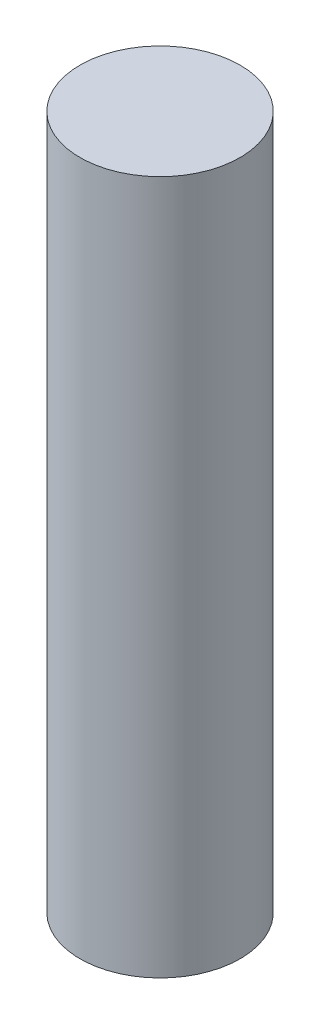
ISO-10303-21;
HEADER;
FILE_DESCRIPTION(('STEP AP214'),'2;1');
FILE_NAME('part.step','',(''),(''),'','','');
FILE_SCHEMA(('AUTOMOTIVE_DESIGN { 1 0 10303 214 1 1 1 1 }'));
ENDSEC;
DATA;
#1=APPLICATION_CONTEXT('core data for automotive mechanical design processes');
#2=APPLICATION_PROTOCOL_DEFINITION('international standard','automotive_design',2000,#1);
#3=PRODUCT_CONTEXT('',#1,'mechanical');
#4=PRODUCT('Part','Part','',(#3));
#5=PRODUCT_RELATED_PRODUCT_CATEGORY('part','',(#4));
#6=PRODUCT_DEFINITION_FORMATION('','',#4);
#7=PRODUCT_DEFINITION_CONTEXT('part definition',#1,'design');
#8=PRODUCT_DEFINITION('design','',#6,#7);
#9=PRODUCT_DEFINITION_SHAPE('','',#8);
#10=(LENGTH_UNIT() NAMED_UNIT(*) SI_UNIT(.MILLI.,.METRE.));
#11=(NAMED_UNIT(*) PLANE_ANGLE_UNIT() SI_UNIT($,.RADIAN.));
#12=(NAMED_UNIT(*) SI_UNIT($,.STERADIAN.) SOLID_ANGLE_UNIT());
#13=UNCERTAINTY_MEASURE_WITH_UNIT(LENGTH_MEASURE(1.E-05),#10,'distance_accuracy_value','');
#14=(GEOMETRIC_REPRESENTATION_CONTEXT(3) GLOBAL_UNCERTAINTY_ASSIGNED_CONTEXT((#13)) GLOBAL_UNIT_ASSIGNED_CONTEXT((#10,
#11,#12)) REPRESENTATION_CONTEXT('',''));
#15=CARTESIAN_POINT('',(0.,0.,0.));
#16=DIRECTION('',(0.,0.,1.));
#17=DIRECTION('',(1.,0.,0.));
#18=AXIS2_PLACEMENT_3D('',#15,#16,#17);
#19=CARTESIAN_POINT('',(0.,0.,0.));
#20=DIRECTION('',(0.,-1.,0.));
#21=DIRECTION('',(0.,0.,-1.));
#22=AXIS2_PLACEMENT_3D('',#19,#20,#21);
#23=PLANE('',#22);
#24=CARTESIAN_POINT('',(0.,0.,0.));
#25=DIRECTION('',(0.,-1.,0.));
#26=DIRECTION('',(0.,0.,-1.));
#27=AXIS2_PLACEMENT_3D('',#24,#25,#26);
#28=CIRCLE('',#27,1.5);
#29=CARTESIAN_POINT('',(0.,0.,-1.5));
#30=VERTEX_POINT('',#29);
#31=EDGE_CURVE('E10',#30,#30,#28,.T.);
#32=ORIENTED_EDGE('',*,*,#31,.T.);
#33=EDGE_LOOP('',(#32));
#34=FACE_BOUND('',#33,.T.);
#35=ADVANCED_FACE('F35',(#34),#23,.T.);
#36=CARTESIAN_POINT('',(0.,11.,0.));
#37=DIRECTION('',(0.,-1.,0.));
#38=DIRECTION('',(0.,0.,-1.));
#39=AXIS2_PLACEMENT_3D('',#36,#37,#38);
#40=CYLINDRICAL_SURFACE('',#39,1.5);
#41=CARTESIAN_POINT('',(0.,13.,0.));
#42=DIRECTION('',(0.,-1.,0.));
#43=DIRECTION('',(0.,0.,-1.));
#44=AXIS2_PLACEMENT_3D('',#41,#42,#43);
#45=CIRCLE('',#44,1.5);
#46=CARTESIAN_POINT('',(0.,13.,-1.5));
#47=VERTEX_POINT('',#46);
#48=EDGE_CURVE('E41',#47,#47,#45,.T.);
#49=ORIENTED_EDGE('',*,*,#48,.T.);
#50=EDGE_LOOP('',(#49));
#51=FACE_BOUND('',#50,.T.);
#52=ORIENTED_EDGE('',*,*,#31,.F.);
#53=EDGE_LOOP('',(#52));
#54=FACE_BOUND('',#53,.T.);
#55=ADVANCED_FACE('F47',(#51,#54),#40,.T.);
#56=CARTESIAN_POINT('',(0.,13.,0.));
#57=DIRECTION('',(0.,-1.,0.));
#58=DIRECTION('',(0.,0.,-1.));
#59=AXIS2_PLACEMENT_3D('',#56,#57,#58);
#60=PLANE('',#59);
#61=ORIENTED_EDGE('',*,*,#48,.F.);
#62=EDGE_LOOP('',(#61));
#63=FACE_BOUND('',#62,.T.);
#64=ADVANCED_FACE('F50',(#63),#60,.F.);
#65=CLOSED_SHELL('',(#35,#55,#64));
#66=MANIFOLD_SOLID_BREP('B2',#65);
#67=ADVANCED_BREP_SHAPE_REPRESENTATION('',(#18,#66),#14);
#68=SHAPE_DEFINITION_REPRESENTATION(#9,#67);
ENDSEC;
END-ISO-10303-21;
